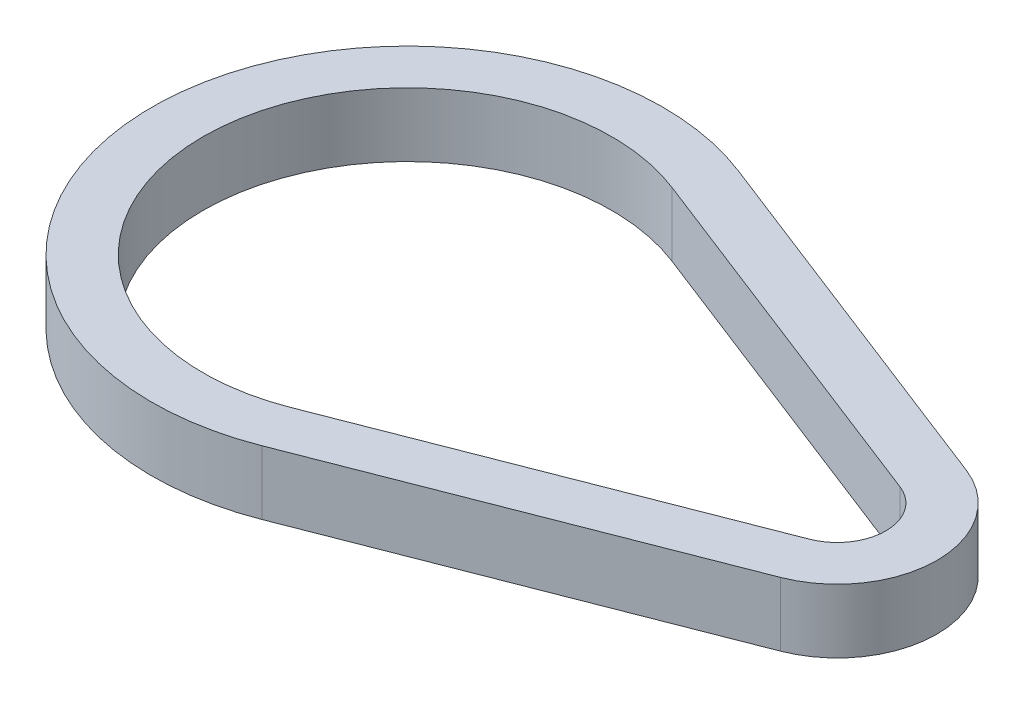
ISO-10303-21;
HEADER;
FILE_DESCRIPTION(('STEP AP214'),'2;1');
FILE_NAME('part.step','',(''),(''),'','','');
FILE_SCHEMA(('AUTOMOTIVE_DESIGN { 1 0 10303 214 1 1 1 1 }'));
ENDSEC;
DATA;
#1=APPLICATION_CONTEXT('core data for automotive mechanical design processes');
#2=APPLICATION_PROTOCOL_DEFINITION('international standard','automotive_design',2000,#1);
#3=PRODUCT_CONTEXT('',#1,'mechanical');
#4=PRODUCT('Part','Part','',(#3));
#5=PRODUCT_RELATED_PRODUCT_CATEGORY('part','',(#4));
#6=PRODUCT_DEFINITION_FORMATION('','',#4);
#7=PRODUCT_DEFINITION_CONTEXT('part definition',#1,'design');
#8=PRODUCT_DEFINITION('design','',#6,#7);
#9=PRODUCT_DEFINITION_SHAPE('','',#8);
#10=(LENGTH_UNIT() NAMED_UNIT(*) SI_UNIT(.MILLI.,.METRE.));
#11=(NAMED_UNIT(*) PLANE_ANGLE_UNIT() SI_UNIT($,.RADIAN.));
#12=(NAMED_UNIT(*) SI_UNIT($,.STERADIAN.) SOLID_ANGLE_UNIT());
#13=UNCERTAINTY_MEASURE_WITH_UNIT(LENGTH_MEASURE(1.E-05),#10,'distance_accuracy_value','');
#14=(GEOMETRIC_REPRESENTATION_CONTEXT(3) GLOBAL_UNCERTAINTY_ASSIGNED_CONTEXT((#13)) GLOBAL_UNIT_ASSIGNED_CONTEXT((#10,
#11,#12)) REPRESENTATION_CONTEXT('',''));
#15=CARTESIAN_POINT('',(0.,0.,0.));
#16=DIRECTION('',(0.,0.,1.));
#17=DIRECTION('',(1.,0.,0.));
#18=AXIS2_PLACEMENT_3D('',#15,#16,#17);
#19=CARTESIAN_POINT('',(84.1,12.5,0.));
#20=DIRECTION('',(0.,1.,0.));
#21=DIRECTION('',(0.,0.,1.));
#22=AXIS2_PLACEMENT_3D('',#19,#20,#21);
#23=PLANE('',#22);
#24=CARTESIAN_POINT('',(84.1,12.5,0.));
#25=DIRECTION('',(0.,1.,0.));
#26=DIRECTION('',(1.,0.,0.));
#27=AXIS2_PLACEMENT_3D('',#24,#25,#26);
#28=CIRCLE('',#27,19.5);
#29=CARTESIAN_POINT('',(91.1719381688466,12.5,18.1724431636478));
#30=VERTEX_POINT('',#29);
#31=CARTESIAN_POINT('',(91.1719381688466,12.5,-18.1724431636478));
#32=VERTEX_POINT('',#31);
#33=EDGE_CURVE('E162',#30,#32,#28,.T.);
#34=ORIENTED_EDGE('',*,*,#33,.T.);
#35=DIRECTION('',(-0.93192016223835,0.,-0.362663495838288));
#36=VECTOR('',#35,1.);
#37=CARTESIAN_POINT('',(18.1331747919144,12.5,-46.5960081119175));
#38=LINE('',#37,#36);
#39=CARTESIAN_POINT('',(18.1331747919144,12.5,-46.5960081119175));
#40=VERTEX_POINT('',#39);
#41=EDGE_CURVE('E165',#32,#40,#38,.T.);
#42=ORIENTED_EDGE('',*,*,#41,.T.);
#43=CARTESIAN_POINT('',(0.,12.5,0.));
#44=DIRECTION('',(0.,1.,0.));
#45=DIRECTION('',(1.,0.,0.));
#46=AXIS2_PLACEMENT_3D('',#43,#44,#45);
#47=CIRCLE('',#46,50.);
#48=CARTESIAN_POINT('',(18.1331747919144,12.5,46.5960081119175));
#49=VERTEX_POINT('',#48);
#50=EDGE_CURVE('E168',#40,#49,#47,.T.);
#51=ORIENTED_EDGE('',*,*,#50,.T.);
#52=DIRECTION('',(0.93192016223835,0.,-0.362663495838288));
#53=VECTOR('',#52,1.);
#54=CARTESIAN_POINT('',(91.1719381688466,12.5,18.1724431636478));
#55=LINE('',#54,#53);
#56=EDGE_CURVE('E170',#49,#30,#55,.T.);
#57=ORIENTED_EDGE('',*,*,#56,.T.);
#58=EDGE_LOOP('',(#34,#42,#51,#57));
#59=FACE_BOUND('',#58,.T.);
#60=DIRECTION('',(-0.93192016223835,0.,-0.362663495838288));
#61=VECTOR('',#60,1.);
#62=CARTESIAN_POINT('',(14.5065398335315,12.5,-37.276806489534));
#63=LINE('',#62,#61);
#64=CARTESIAN_POINT('',(87.5453032104637,12.5,-8.85324154126433));
#65=VERTEX_POINT('',#64);
#66=CARTESIAN_POINT('',(14.5065398335315,12.5,-37.276806489534));
#67=VERTEX_POINT('',#66);
#68=EDGE_CURVE('E134',#65,#67,#63,.T.);
#69=ORIENTED_EDGE('',*,*,#68,.F.);
#70=CARTESIAN_POINT('',(84.1,12.5,0.));
#71=DIRECTION('',(0.,1.,0.));
#72=DIRECTION('',(0.,0.,1.));
#73=AXIS2_PLACEMENT_3D('',#70,#71,#72);
#74=CIRCLE('',#73,9.50000000000001);
#75=CARTESIAN_POINT('',(87.5453032104637,12.5,8.85324154126433));
#76=VERTEX_POINT('',#75);
#77=EDGE_CURVE('E126',#76,#65,#74,.T.);
#78=ORIENTED_EDGE('',*,*,#77,.F.);
#79=DIRECTION('',(0.93192016223835,0.,-0.362663495838288));
#80=VECTOR('',#79,1.);
#81=CARTESIAN_POINT('',(87.5453032104637,12.5,8.85324154126433));
#82=LINE('',#81,#80);
#83=CARTESIAN_POINT('',(14.5065398335315,12.5,37.276806489534));
#84=VERTEX_POINT('',#83);
#85=EDGE_CURVE('E148',#84,#76,#82,.T.);
#86=ORIENTED_EDGE('',*,*,#85,.F.);
#87=CARTESIAN_POINT('',(0.,12.5,0.));
#88=DIRECTION('',(0.,1.,0.));
#89=DIRECTION('',(0.,0.,1.));
#90=AXIS2_PLACEMENT_3D('',#87,#88,#89);
#91=CIRCLE('',#90,40.);
#92=EDGE_CURVE('E146',#67,#84,#91,.T.);
#93=ORIENTED_EDGE('',*,*,#92,.F.);
#94=EDGE_LOOP('',(#69,#78,#86,#93));
#95=FACE_BOUND('',#94,.T.);
#96=ADVANCED_FACE('F61',(#59,#95),#23,.T.);
#97=CARTESIAN_POINT('',(84.1,0.,0.));
#98=DIRECTION('',(0.,1.,0.));
#99=DIRECTION('',(0.,0.,1.));
#100=AXIS2_PLACEMENT_3D('',#97,#98,#99);
#101=PLANE('',#100);
#102=CARTESIAN_POINT('',(84.1,0.,0.));
#103=DIRECTION('',(0.,1.,0.));
#104=DIRECTION('',(1.,0.,0.));
#105=AXIS2_PLACEMENT_3D('',#102,#103,#104);
#106=CIRCLE('',#105,19.5);
#107=CARTESIAN_POINT('',(91.1719381688466,0.,18.1724431636478));
#108=VERTEX_POINT('',#107);
#109=CARTESIAN_POINT('',(91.1719381688466,0.,-18.1724431636478));
#110=VERTEX_POINT('',#109);
#111=EDGE_CURVE('E142',#108,#110,#106,.T.);
#112=ORIENTED_EDGE('',*,*,#111,.F.);
#113=DIRECTION('',(0.93192016223835,0.,-0.362663495838288));
#114=VECTOR('',#113,1.);
#115=CARTESIAN_POINT('',(91.1719381688466,0.,18.1724431636478));
#116=LINE('',#115,#114);
#117=CARTESIAN_POINT('',(18.1331747919144,0.,46.5960081119175));
#118=VERTEX_POINT('',#117);
#119=EDGE_CURVE('E166',#118,#108,#116,.T.);
#120=ORIENTED_EDGE('',*,*,#119,.F.);
#121=CARTESIAN_POINT('',(0.,0.,0.));
#122=DIRECTION('',(0.,1.,0.));
#123=DIRECTION('',(1.,0.,0.));
#124=AXIS2_PLACEMENT_3D('',#121,#122,#123);
#125=CIRCLE('',#124,50.);
#126=CARTESIAN_POINT('',(18.1331747919144,0.,-46.5960081119175));
#127=VERTEX_POINT('',#126);
#128=EDGE_CURVE('E177',#127,#118,#125,.T.);
#129=ORIENTED_EDGE('',*,*,#128,.F.);
#130=DIRECTION('',(-0.93192016223835,0.,-0.362663495838288));
#131=VECTOR('',#130,1.);
#132=CARTESIAN_POINT('',(18.1331747919144,0.,-46.5960081119175));
#133=LINE('',#132,#131);
#134=EDGE_CURVE('E175',#110,#127,#133,.T.);
#135=ORIENTED_EDGE('',*,*,#134,.F.);
#136=EDGE_LOOP('',(#112,#120,#129,#135));
#137=FACE_BOUND('',#136,.T.);
#138=CARTESIAN_POINT('',(84.1,0.,0.));
#139=DIRECTION('',(0.,1.,0.));
#140=DIRECTION('',(0.,0.,1.));
#141=AXIS2_PLACEMENT_3D('',#138,#139,#140);
#142=CIRCLE('',#141,9.50000000000001);
#143=CARTESIAN_POINT('',(87.5453032104637,0.,8.85324154126433));
#144=VERTEX_POINT('',#143);
#145=CARTESIAN_POINT('',(87.5453032104637,0.,-8.85324154126433));
#146=VERTEX_POINT('',#145);
#147=EDGE_CURVE('E84',#144,#146,#142,.T.);
#148=ORIENTED_EDGE('',*,*,#147,.T.);
#149=DIRECTION('',(-0.93192016223835,0.,-0.362663495838288));
#150=VECTOR('',#149,1.);
#151=CARTESIAN_POINT('',(14.5065398335315,0.,-37.276806489534));
#152=LINE('',#151,#150);
#153=CARTESIAN_POINT('',(14.5065398335315,0.,-37.276806489534));
#154=VERTEX_POINT('',#153);
#155=EDGE_CURVE('E141',#146,#154,#152,.T.);
#156=ORIENTED_EDGE('',*,*,#155,.T.);
#157=CARTESIAN_POINT('',(0.,0.,0.));
#158=DIRECTION('',(0.,1.,0.));
#159=DIRECTION('',(0.,0.,1.));
#160=AXIS2_PLACEMENT_3D('',#157,#158,#159);
#161=CIRCLE('',#160,40.);
#162=CARTESIAN_POINT('',(14.5065398335315,0.,37.276806489534));
#163=VERTEX_POINT('',#162);
#164=EDGE_CURVE('E154',#154,#163,#161,.T.);
#165=ORIENTED_EDGE('',*,*,#164,.T.);
#166=DIRECTION('',(0.93192016223835,0.,-0.362663495838288));
#167=VECTOR('',#166,1.);
#168=CARTESIAN_POINT('',(87.5453032104637,0.,8.85324154126433));
#169=LINE('',#168,#167);
#170=EDGE_CURVE('E135',#163,#144,#169,.T.);
#171=ORIENTED_EDGE('',*,*,#170,.T.);
#172=EDGE_LOOP('',(#148,#156,#165,#171));
#173=FACE_BOUND('',#172,.T.);
#174=ADVANCED_FACE('F195',(#137,#173),#101,.F.);
#175=CARTESIAN_POINT('',(84.1,12.5,0.));
#176=DIRECTION('',(0.,-1.,0.));
#177=DIRECTION('',(0.,0.,-1.));
#178=AXIS2_PLACEMENT_3D('',#175,#176,#177);
#179=CYLINDRICAL_SURFACE('',#178,19.5);
#180=ORIENTED_EDGE('',*,*,#111,.T.);
#181=DIRECTION('',(0.,-1.,0.));
#182=VECTOR('',#181,1.);
#183=CARTESIAN_POINT('',(91.1719381688466,12.5,-18.1724431636478));
#184=LINE('',#183,#182);
#185=EDGE_CURVE('E12',#32,#110,#184,.T.);
#186=ORIENTED_EDGE('',*,*,#185,.F.);
#187=ORIENTED_EDGE('',*,*,#33,.F.);
#188=DIRECTION('',(0.,-1.,0.));
#189=VECTOR('',#188,1.);
#190=CARTESIAN_POINT('',(91.1719381688466,12.5,18.1724431636478));
#191=LINE('',#190,#189);
#192=EDGE_CURVE('E172',#30,#108,#191,.T.);
#193=ORIENTED_EDGE('',*,*,#192,.T.);
#194=EDGE_LOOP('',(#180,#186,#187,#193));
#195=FACE_BOUND('',#194,.T.);
#196=ADVANCED_FACE('F63',(#195),#179,.T.);
#197=CARTESIAN_POINT('',(18.1331747919144,12.5,-46.5960081119175));
#198=DIRECTION('',(-0.362663495838288,0.,0.93192016223835));
#199=DIRECTION('',(0.93192016223835,0.,0.362663495838288));
#200=AXIS2_PLACEMENT_3D('',#197,#198,#199);
#201=PLANE('',#200);
#202=ORIENTED_EDGE('',*,*,#134,.T.);
#203=DIRECTION('',(0.,-1.,0.));
#204=VECTOR('',#203,1.);
#205=CARTESIAN_POINT('',(18.1331747919144,12.5,-46.5960081119175));
#206=LINE('',#205,#204);
#207=EDGE_CURVE('E69',#40,#127,#206,.T.);
#208=ORIENTED_EDGE('',*,*,#207,.F.);
#209=ORIENTED_EDGE('',*,*,#41,.F.);
#210=ORIENTED_EDGE('',*,*,#185,.T.);
#211=EDGE_LOOP('',(#202,#208,#209,#210));
#212=FACE_BOUND('',#211,.T.);
#213=ADVANCED_FACE('F205',(#212),#201,.F.);
#214=CARTESIAN_POINT('',(0.,12.5,0.));
#215=DIRECTION('',(0.,-1.,0.));
#216=DIRECTION('',(0.,0.,-1.));
#217=AXIS2_PLACEMENT_3D('',#214,#215,#216);
#218=CYLINDRICAL_SURFACE('',#217,50.);
#219=ORIENTED_EDGE('',*,*,#128,.T.);
#220=DIRECTION('',(0.,-1.,0.));
#221=VECTOR('',#220,1.);
#222=CARTESIAN_POINT('',(18.1331747919144,12.5,46.5960081119175));
#223=LINE('',#222,#221);
#224=EDGE_CURVE('E182',#49,#118,#223,.T.);
#225=ORIENTED_EDGE('',*,*,#224,.F.);
#226=ORIENTED_EDGE('',*,*,#50,.F.);
#227=ORIENTED_EDGE('',*,*,#207,.T.);
#228=EDGE_LOOP('',(#219,#225,#226,#227));
#229=FACE_BOUND('',#228,.T.);
#230=ADVANCED_FACE('F189',(#229),#218,.T.);
#231=CARTESIAN_POINT('',(91.1719381688466,12.5,18.1724431636478));
#232=DIRECTION('',(-0.362663495838288,0.,-0.93192016223835));
#233=DIRECTION('',(-0.93192016223835,0.,0.362663495838288));
#234=AXIS2_PLACEMENT_3D('',#231,#232,#233);
#235=PLANE('',#234);
#236=ORIENTED_EDGE('',*,*,#119,.T.);
#237=ORIENTED_EDGE('',*,*,#192,.F.);
#238=ORIENTED_EDGE('',*,*,#56,.F.);
#239=ORIENTED_EDGE('',*,*,#224,.T.);
#240=EDGE_LOOP('',(#236,#237,#238,#239));
#241=FACE_BOUND('',#240,.T.);
#242=ADVANCED_FACE('F199',(#241),#235,.F.);
#243=CARTESIAN_POINT('',(84.1,12.5,0.));
#244=DIRECTION('',(0.,-1.,0.));
#245=DIRECTION('',(0.,0.,-1.));
#246=AXIS2_PLACEMENT_3D('',#243,#244,#245);
#247=CYLINDRICAL_SURFACE('',#246,9.50000000000001);
#248=ORIENTED_EDGE('',*,*,#147,.F.);
#249=DIRECTION('',(0.,-1.,0.));
#250=VECTOR('',#249,1.);
#251=CARTESIAN_POINT('',(87.5453032104637,12.5,8.85324154126433));
#252=LINE('',#251,#250);
#253=EDGE_CURVE('E130',#76,#144,#252,.T.);
#254=ORIENTED_EDGE('',*,*,#253,.F.);
#255=ORIENTED_EDGE('',*,*,#77,.T.);
#256=DIRECTION('',(0.,-1.,0.));
#257=VECTOR('',#256,1.);
#258=CARTESIAN_POINT('',(87.5453032104637,12.5,-8.85324154126433));
#259=LINE('',#258,#257);
#260=EDGE_CURVE('E129',#65,#146,#259,.T.);
#261=ORIENTED_EDGE('',*,*,#260,.T.);
#262=EDGE_LOOP('',(#248,#254,#255,#261));
#263=FACE_BOUND('',#262,.T.);
#264=ADVANCED_FACE('F128',(#263),#247,.F.);
#265=CARTESIAN_POINT('',(14.5065398335315,12.5,-37.276806489534));
#266=DIRECTION('',(-0.362663495838288,0.,0.93192016223835));
#267=DIRECTION('',(0.93192016223835,0.,0.362663495838288));
#268=AXIS2_PLACEMENT_3D('',#265,#266,#267);
#269=PLANE('',#268);
#270=ORIENTED_EDGE('',*,*,#155,.F.);
#271=ORIENTED_EDGE('',*,*,#260,.F.);
#272=ORIENTED_EDGE('',*,*,#68,.T.);
#273=DIRECTION('',(0.,-1.,0.));
#274=VECTOR('',#273,1.);
#275=CARTESIAN_POINT('',(14.5065398335315,12.5,-37.276806489534));
#276=LINE('',#275,#274);
#277=EDGE_CURVE('E143',#67,#154,#276,.T.);
#278=ORIENTED_EDGE('',*,*,#277,.T.);
#279=EDGE_LOOP('',(#270,#271,#272,#278));
#280=FACE_BOUND('',#279,.T.);
#281=ADVANCED_FACE('F138',(#280),#269,.T.);
#282=CARTESIAN_POINT('',(0.,12.5,0.));
#283=DIRECTION('',(0.,-1.,0.));
#284=DIRECTION('',(0.,0.,-1.));
#285=AXIS2_PLACEMENT_3D('',#282,#283,#284);
#286=CYLINDRICAL_SURFACE('',#285,40.);
#287=ORIENTED_EDGE('',*,*,#164,.F.);
#288=ORIENTED_EDGE('',*,*,#277,.F.);
#289=ORIENTED_EDGE('',*,*,#92,.T.);
#290=DIRECTION('',(0.,-1.,0.));
#291=VECTOR('',#290,1.);
#292=CARTESIAN_POINT('',(14.5065398335315,12.5,37.276806489534));
#293=LINE('',#292,#291);
#294=EDGE_CURVE('E76',#84,#163,#293,.T.);
#295=ORIENTED_EDGE('',*,*,#294,.T.);
#296=EDGE_LOOP('',(#287,#288,#289,#295));
#297=FACE_BOUND('',#296,.T.);
#298=ADVANCED_FACE('F228',(#297),#286,.F.);
#299=CARTESIAN_POINT('',(87.5453032104637,12.5,8.85324154126433));
#300=DIRECTION('',(-0.362663495838288,0.,-0.93192016223835));
#301=DIRECTION('',(-0.93192016223835,0.,0.362663495838288));
#302=AXIS2_PLACEMENT_3D('',#299,#300,#301);
#303=PLANE('',#302);
#304=ORIENTED_EDGE('',*,*,#170,.F.);
#305=ORIENTED_EDGE('',*,*,#294,.F.);
#306=ORIENTED_EDGE('',*,*,#85,.T.);
#307=ORIENTED_EDGE('',*,*,#253,.T.);
#308=EDGE_LOOP('',(#304,#305,#306,#307));
#309=FACE_BOUND('',#308,.T.);
#310=ADVANCED_FACE('F232',(#309),#303,.T.);
#311=CLOSED_SHELL('',(#96,#174,#196,#213,#230,#242,#264,#281,#298,#310));
#312=MANIFOLD_SOLID_BREP('B2',#311);
#313=ADVANCED_BREP_SHAPE_REPRESENTATION('',(#18,#312),#14);
#314=SHAPE_DEFINITION_REPRESENTATION(#9,#313);
ENDSEC;
END-ISO-10303-21;
